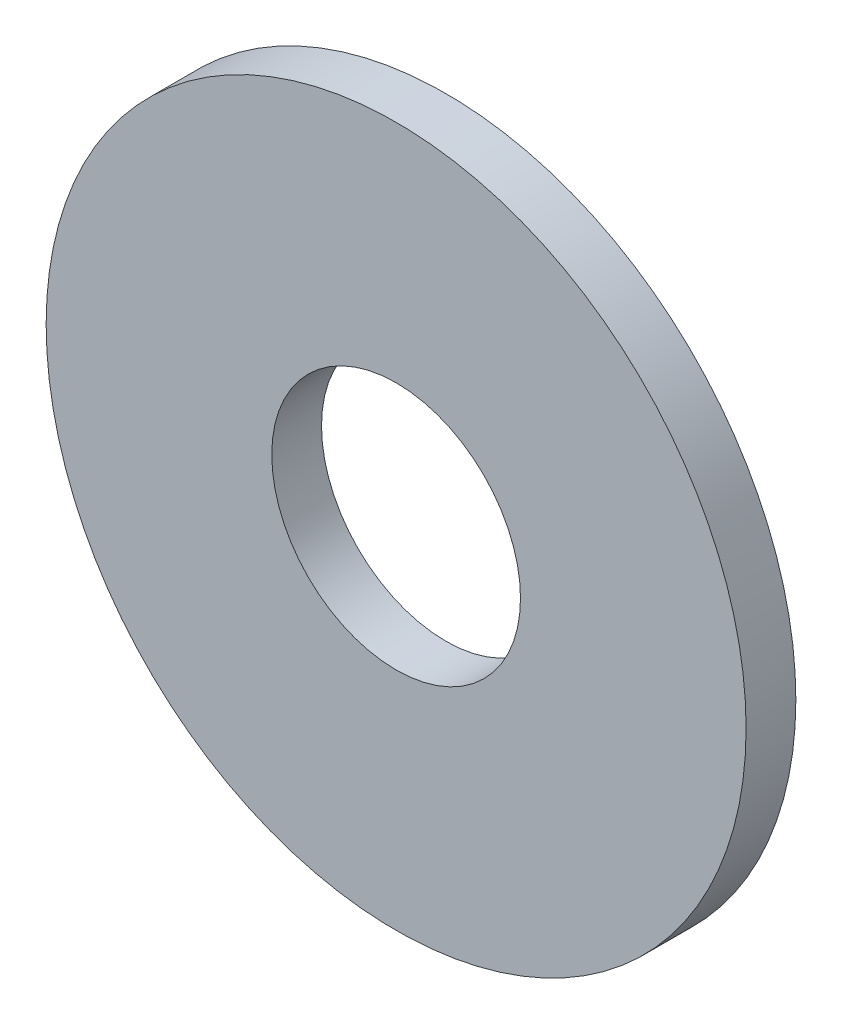
ISO-10303-21;
HEADER;
FILE_DESCRIPTION(('STEP AP214'),'2;1');
FILE_NAME('part.step','',(''),(''),'','','');
FILE_SCHEMA(('AUTOMOTIVE_DESIGN { 1 0 10303 214 1 1 1 1 }'));
ENDSEC;
DATA;
#1=APPLICATION_CONTEXT('core data for automotive mechanical design processes');
#2=APPLICATION_PROTOCOL_DEFINITION('international standard','automotive_design',2000,#1);
#3=PRODUCT_CONTEXT('',#1,'mechanical');
#4=PRODUCT('Part','Part','',(#3));
#5=PRODUCT_RELATED_PRODUCT_CATEGORY('part','',(#4));
#6=PRODUCT_DEFINITION_FORMATION('','',#4);
#7=PRODUCT_DEFINITION_CONTEXT('part definition',#1,'design');
#8=PRODUCT_DEFINITION('design','',#6,#7);
#9=PRODUCT_DEFINITION_SHAPE('','',#8);
#10=(LENGTH_UNIT() NAMED_UNIT(*) SI_UNIT(.MILLI.,.METRE.));
#11=(NAMED_UNIT(*) PLANE_ANGLE_UNIT() SI_UNIT($,.RADIAN.));
#12=(NAMED_UNIT(*) SI_UNIT($,.STERADIAN.) SOLID_ANGLE_UNIT());
#13=UNCERTAINTY_MEASURE_WITH_UNIT(LENGTH_MEASURE(1.E-05),#10,'distance_accuracy_value','');
#14=(GEOMETRIC_REPRESENTATION_CONTEXT(3) GLOBAL_UNCERTAINTY_ASSIGNED_CONTEXT((#13)) GLOBAL_UNIT_ASSIGNED_CONTEXT((#10,
#11,#12)) REPRESENTATION_CONTEXT('',''));
#15=CARTESIAN_POINT('',(0.,0.,0.));
#16=DIRECTION('',(0.,0.,1.));
#17=DIRECTION('',(1.,0.,0.));
#18=AXIS2_PLACEMENT_3D('',#15,#16,#17);
#19=CARTESIAN_POINT('',(0.,0.,2.54));
#20=DIRECTION('',(0.,0.,1.));
#21=DIRECTION('',(1.,0.,0.));
#22=AXIS2_PLACEMENT_3D('',#19,#20,#21);
#23=PLANE('',#22);
#24=CARTESIAN_POINT('',(0.,0.,2.54));
#25=DIRECTION('',(0.,0.,1.));
#26=DIRECTION('',(1.,0.,0.));
#27=AXIS2_PLACEMENT_3D('',#24,#25,#26);
#28=CIRCLE('',#27,17.8689);
#29=CARTESIAN_POINT('',(17.8689,0.,2.54));
#30=VERTEX_POINT('',#29);
#31=EDGE_CURVE('E10',#30,#30,#28,.T.);
#32=ORIENTED_EDGE('',*,*,#31,.T.);
#33=EDGE_LOOP('',(#32));
#34=FACE_BOUND('',#33,.T.);
#35=CARTESIAN_POINT('',(0.,0.,2.54));
#36=DIRECTION('',(0.,0.,1.));
#37=DIRECTION('',(1.,0.,0.));
#38=AXIS2_PLACEMENT_3D('',#35,#36,#37);
#39=CIRCLE('',#38,6.35);
#40=CARTESIAN_POINT('',(6.35,0.,2.54));
#41=VERTEX_POINT('',#40);
#42=EDGE_CURVE('E42',#41,#41,#39,.T.);
#43=ORIENTED_EDGE('',*,*,#42,.F.);
#44=EDGE_LOOP('',(#43));
#45=FACE_BOUND('',#44,.T.);
#46=ADVANCED_FACE('F31',(#34,#45),#23,.T.);
#47=CARTESIAN_POINT('',(0.,0.,0.));
#48=DIRECTION('',(0.,0.,1.));
#49=DIRECTION('',(1.,0.,0.));
#50=AXIS2_PLACEMENT_3D('',#47,#48,#49);
#51=PLANE('',#50);
#52=CARTESIAN_POINT('',(0.,0.,0.));
#53=DIRECTION('',(0.,0.,1.));
#54=DIRECTION('',(1.,0.,0.));
#55=AXIS2_PLACEMENT_3D('',#52,#53,#54);
#56=CIRCLE('',#55,17.8689);
#57=CARTESIAN_POINT('',(17.8689,0.,0.));
#58=VERTEX_POINT('',#57);
#59=EDGE_CURVE('E35',#58,#58,#56,.T.);
#60=ORIENTED_EDGE('',*,*,#59,.F.);
#61=EDGE_LOOP('',(#60));
#62=FACE_BOUND('',#61,.T.);
#63=CARTESIAN_POINT('',(0.,0.,0.));
#64=DIRECTION('',(0.,0.,1.));
#65=DIRECTION('',(1.,0.,0.));
#66=AXIS2_PLACEMENT_3D('',#63,#64,#65);
#67=CIRCLE('',#66,6.35);
#68=CARTESIAN_POINT('',(6.35,0.,0.));
#69=VERTEX_POINT('',#68);
#70=EDGE_CURVE('E44',#69,#69,#67,.T.);
#71=ORIENTED_EDGE('',*,*,#70,.T.);
#72=EDGE_LOOP('',(#71));
#73=FACE_BOUND('',#72,.T.);
#74=ADVANCED_FACE('F54',(#62,#73),#51,.F.);
#75=CARTESIAN_POINT('',(0.,0.,2.54));
#76=DIRECTION('',(0.,0.,-1.));
#77=DIRECTION('',(-1.,0.,0.));
#78=AXIS2_PLACEMENT_3D('',#75,#76,#77);
#79=CYLINDRICAL_SURFACE('',#78,17.8689);
#80=ORIENTED_EDGE('',*,*,#31,.F.);
#81=EDGE_LOOP('',(#80));
#82=FACE_BOUND('',#81,.T.);
#83=ORIENTED_EDGE('',*,*,#59,.T.);
#84=EDGE_LOOP('',(#83));
#85=FACE_BOUND('',#84,.T.);
#86=ADVANCED_FACE('F33',(#82,#85),#79,.T.);
#87=CARTESIAN_POINT('',(0.,0.,2.54));
#88=DIRECTION('',(0.,0.,-1.));
#89=DIRECTION('',(-1.,0.,0.));
#90=AXIS2_PLACEMENT_3D('',#87,#88,#89);
#91=CYLINDRICAL_SURFACE('',#90,6.35);
#92=ORIENTED_EDGE('',*,*,#42,.T.);
#93=EDGE_LOOP('',(#92));
#94=FACE_BOUND('',#93,.T.);
#95=ORIENTED_EDGE('',*,*,#70,.F.);
#96=EDGE_LOOP('',(#95));
#97=FACE_BOUND('',#96,.T.);
#98=ADVANCED_FACE('F50',(#94,#97),#91,.F.);
#99=CLOSED_SHELL('',(#46,#74,#86,#98));
#100=MANIFOLD_SOLID_BREP('B2',#99);
#101=ADVANCED_BREP_SHAPE_REPRESENTATION('',(#18,#100),#14);
#102=SHAPE_DEFINITION_REPRESENTATION(#9,#101);
ENDSEC;
END-ISO-10303-21;
